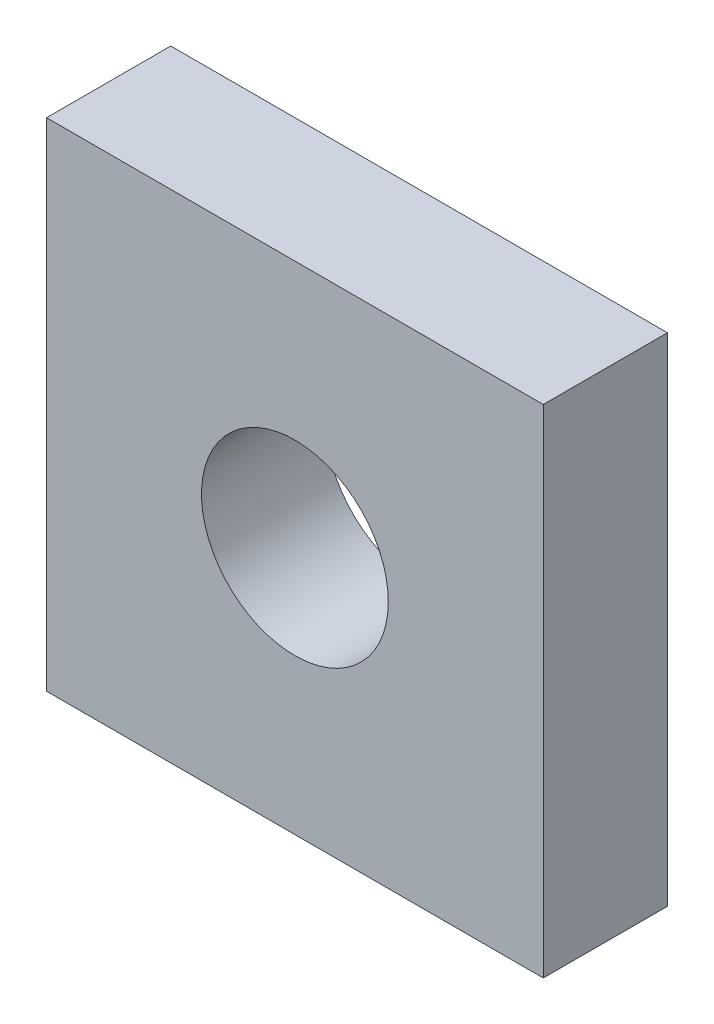
ISO-10303-21;
HEADER;
FILE_DESCRIPTION(('STEP AP214'),'2;1');
FILE_NAME('part.step','',(''),(''),'','','');
FILE_SCHEMA(('AUTOMOTIVE_DESIGN { 1 0 10303 214 1 1 1 1 }'));
ENDSEC;
DATA;
#1=APPLICATION_CONTEXT('core data for automotive mechanical design processes');
#2=APPLICATION_PROTOCOL_DEFINITION('international standard','automotive_design',2000,#1);
#3=PRODUCT_CONTEXT('',#1,'mechanical');
#4=PRODUCT('Part','Part','',(#3));
#5=PRODUCT_RELATED_PRODUCT_CATEGORY('part','',(#4));
#6=PRODUCT_DEFINITION_FORMATION('','',#4);
#7=PRODUCT_DEFINITION_CONTEXT('part definition',#1,'design');
#8=PRODUCT_DEFINITION('design','',#6,#7);
#9=PRODUCT_DEFINITION_SHAPE('','',#8);
#10=(LENGTH_UNIT() NAMED_UNIT(*) SI_UNIT(.MILLI.,.METRE.));
#11=(NAMED_UNIT(*) PLANE_ANGLE_UNIT() SI_UNIT($,.RADIAN.));
#12=(NAMED_UNIT(*) SI_UNIT($,.STERADIAN.) SOLID_ANGLE_UNIT());
#13=UNCERTAINTY_MEASURE_WITH_UNIT(LENGTH_MEASURE(1.E-05),#10,'distance_accuracy_value','');
#14=(GEOMETRIC_REPRESENTATION_CONTEXT(3) GLOBAL_UNCERTAINTY_ASSIGNED_CONTEXT((#13)) GLOBAL_UNIT_ASSIGNED_CONTEXT((#10,
#11,#12)) REPRESENTATION_CONTEXT('',''));
#15=CARTESIAN_POINT('',(0.,0.,0.));
#16=DIRECTION('',(0.,0.,1.));
#17=DIRECTION('',(1.,0.,0.));
#18=AXIS2_PLACEMENT_3D('',#15,#16,#17);
#19=CARTESIAN_POINT('',(0.,0.,6.35));
#20=DIRECTION('',(0.,0.,-1.));
#21=DIRECTION('',(-1.,0.,0.));
#22=AXIS2_PLACEMENT_3D('',#19,#20,#21);
#23=PLANE('',#22);
#24=DIRECTION('',(1.,0.,0.));
#25=VECTOR('',#24,1.);
#26=CARTESIAN_POINT('',(-12.8606597692116,-5.85860277987313,6.35));
#27=LINE('',#26,#25);
#28=CARTESIAN_POINT('',(-12.8606597692116,-5.85860277987313,6.35));
#29=VERTEX_POINT('',#28);
#30=CARTESIAN_POINT('',(12.5393402307884,-5.85860277987313,6.35));
#31=VERTEX_POINT('',#30);
#32=EDGE_CURVE('E89',#29,#31,#27,.T.);
#33=ORIENTED_EDGE('',*,*,#32,.T.);
#34=DIRECTION('',(0.,1.,0.));
#35=VECTOR('',#34,1.);
#36=CARTESIAN_POINT('',(12.5393402307884,19.5413972201269,6.35));
#37=LINE('',#36,#35);
#38=CARTESIAN_POINT('',(12.5393402307884,19.5413972201269,6.35));
#39=VERTEX_POINT('',#38);
#40=EDGE_CURVE('E84',#31,#39,#37,.T.);
#41=ORIENTED_EDGE('',*,*,#40,.T.);
#42=DIRECTION('',(-1.,0.,0.));
#43=VECTOR('',#42,1.);
#44=CARTESIAN_POINT('',(-12.8606597692116,19.5413972201269,6.35));
#45=LINE('',#44,#43);
#46=CARTESIAN_POINT('',(-12.8606597692116,19.5413972201269,6.35));
#47=VERTEX_POINT('',#46);
#48=EDGE_CURVE('E87',#39,#47,#45,.T.);
#49=ORIENTED_EDGE('',*,*,#48,.T.);
#50=DIRECTION('',(0.,-1.,0.));
#51=VECTOR('',#50,1.);
#52=CARTESIAN_POINT('',(-12.8606597692116,19.5413972201269,6.35));
#53=LINE('',#52,#51);
#54=EDGE_CURVE('E54',#47,#29,#53,.T.);
#55=ORIENTED_EDGE('',*,*,#54,.T.);
#56=EDGE_LOOP('',(#33,#41,#49,#55));
#57=FACE_BOUND('',#56,.T.);
#58=CARTESIAN_POINT('',(-0.160659769211641,6.84139722012688,6.35));
#59=DIRECTION('',(0.,0.,1.));
#60=DIRECTION('',(1.,0.,0.));
#61=AXIS2_PLACEMENT_3D('',#58,#59,#60);
#62=CIRCLE('',#61,4.7752);
#63=CARTESIAN_POINT('',(4.61454023078836,6.84139722012688,6.35));
#64=VERTEX_POINT('',#63);
#65=EDGE_CURVE('E104',#64,#64,#62,.T.);
#66=ORIENTED_EDGE('',*,*,#65,.F.);
#67=EDGE_LOOP('',(#66));
#68=FACE_BOUND('',#67,.T.);
#69=ADVANCED_FACE('F37',(#57,#68),#23,.F.);
#70=CARTESIAN_POINT('',(0.,0.,0.));
#71=DIRECTION('',(0.,0.,-1.));
#72=DIRECTION('',(-1.,0.,0.));
#73=AXIS2_PLACEMENT_3D('',#70,#71,#72);
#74=PLANE('',#73);
#75=DIRECTION('',(1.,0.,0.));
#76=VECTOR('',#75,1.);
#77=CARTESIAN_POINT('',(-12.8606597692116,-5.85860277987313,0.));
#78=LINE('',#77,#76);
#79=CARTESIAN_POINT('',(-12.8606597692116,-5.85860277987313,0.));
#80=VERTEX_POINT('',#79);
#81=CARTESIAN_POINT('',(12.5393402307884,-5.85860277987313,0.));
#82=VERTEX_POINT('',#81);
#83=EDGE_CURVE('E101',#80,#82,#78,.T.);
#84=ORIENTED_EDGE('',*,*,#83,.F.);
#85=DIRECTION('',(0.,-1.,0.));
#86=VECTOR('',#85,1.);
#87=CARTESIAN_POINT('',(-12.8606597692116,19.5413972201269,0.));
#88=LINE('',#87,#86);
#89=CARTESIAN_POINT('',(-12.8606597692116,19.5413972201269,0.));
#90=VERTEX_POINT('',#89);
#91=EDGE_CURVE('E77',#90,#80,#88,.T.);
#92=ORIENTED_EDGE('',*,*,#91,.F.);
#93=DIRECTION('',(-1.,0.,0.));
#94=VECTOR('',#93,1.);
#95=CARTESIAN_POINT('',(-12.8606597692116,19.5413972201269,0.));
#96=LINE('',#95,#94);
#97=CARTESIAN_POINT('',(12.5393402307884,19.5413972201269,0.));
#98=VERTEX_POINT('',#97);
#99=EDGE_CURVE('E71',#98,#90,#96,.T.);
#100=ORIENTED_EDGE('',*,*,#99,.F.);
#101=DIRECTION('',(0.,1.,0.));
#102=VECTOR('',#101,1.);
#103=CARTESIAN_POINT('',(12.5393402307884,19.5413972201269,0.));
#104=LINE('',#103,#102);
#105=EDGE_CURVE('E93',#82,#98,#104,.T.);
#106=ORIENTED_EDGE('',*,*,#105,.F.);
#107=EDGE_LOOP('',(#84,#92,#100,#106));
#108=FACE_BOUND('',#107,.T.);
#109=CARTESIAN_POINT('',(-0.160659769211641,6.84139722012688,0.));
#110=DIRECTION('',(0.,0.,1.));
#111=DIRECTION('',(1.,0.,0.));
#112=AXIS2_PLACEMENT_3D('',#109,#110,#111);
#113=CIRCLE('',#112,4.7752);
#114=CARTESIAN_POINT('',(4.61454023078836,6.84139722012688,0.));
#115=VERTEX_POINT('',#114);
#116=EDGE_CURVE('E116',#115,#115,#113,.T.);
#117=ORIENTED_EDGE('',*,*,#116,.T.);
#118=EDGE_LOOP('',(#117));
#119=FACE_BOUND('',#118,.T.);
#120=ADVANCED_FACE('F112',(#108,#119),#74,.T.);
#121=CARTESIAN_POINT('',(-12.8606597692116,-5.85860277987313,6.35));
#122=DIRECTION('',(0.,1.,0.));
#123=DIRECTION('',(0.,0.,1.));
#124=AXIS2_PLACEMENT_3D('',#121,#122,#123);
#125=PLANE('',#124);
#126=ORIENTED_EDGE('',*,*,#83,.T.);
#127=DIRECTION('',(0.,0.,-1.));
#128=VECTOR('',#127,1.);
#129=CARTESIAN_POINT('',(12.5393402307884,-5.85860277987313,6.35));
#130=LINE('',#129,#128);
#131=EDGE_CURVE('E11',#31,#82,#130,.T.);
#132=ORIENTED_EDGE('',*,*,#131,.F.);
#133=ORIENTED_EDGE('',*,*,#32,.F.);
#134=DIRECTION('',(0.,0.,-1.));
#135=VECTOR('',#134,1.);
#136=CARTESIAN_POINT('',(-12.8606597692116,-5.85860277987313,6.35));
#137=LINE('',#136,#135);
#138=EDGE_CURVE('E97',#29,#80,#137,.T.);
#139=ORIENTED_EDGE('',*,*,#138,.T.);
#140=EDGE_LOOP('',(#126,#132,#133,#139));
#141=FACE_BOUND('',#140,.T.);
#142=ADVANCED_FACE('F39',(#141),#125,.F.);
#143=CARTESIAN_POINT('',(12.5393402307884,19.5413972201269,6.35));
#144=DIRECTION('',(-1.,0.,0.));
#145=DIRECTION('',(0.,-1.,0.));
#146=AXIS2_PLACEMENT_3D('',#143,#144,#145);
#147=PLANE('',#146);
#148=ORIENTED_EDGE('',*,*,#105,.T.);
#149=DIRECTION('',(0.,0.,-1.));
#150=VECTOR('',#149,1.);
#151=CARTESIAN_POINT('',(12.5393402307884,19.5413972201269,6.35));
#152=LINE('',#151,#150);
#153=EDGE_CURVE('E46',#39,#98,#152,.T.);
#154=ORIENTED_EDGE('',*,*,#153,.F.);
#155=ORIENTED_EDGE('',*,*,#40,.F.);
#156=ORIENTED_EDGE('',*,*,#131,.T.);
#157=EDGE_LOOP('',(#148,#154,#155,#156));
#158=FACE_BOUND('',#157,.T.);
#159=ADVANCED_FACE('F92',(#158),#147,.F.);
#160=CARTESIAN_POINT('',(-12.8606597692116,19.5413972201269,6.35));
#161=DIRECTION('',(0.,-1.,0.));
#162=DIRECTION('',(0.,0.,-1.));
#163=AXIS2_PLACEMENT_3D('',#160,#161,#162);
#164=PLANE('',#163);
#165=ORIENTED_EDGE('',*,*,#99,.T.);
#166=DIRECTION('',(0.,0.,-1.));
#167=VECTOR('',#166,1.);
#168=CARTESIAN_POINT('',(-12.8606597692116,19.5413972201269,6.35));
#169=LINE('',#168,#167);
#170=EDGE_CURVE('E94',#47,#90,#169,.T.);
#171=ORIENTED_EDGE('',*,*,#170,.F.);
#172=ORIENTED_EDGE('',*,*,#48,.F.);
#173=ORIENTED_EDGE('',*,*,#153,.T.);
#174=EDGE_LOOP('',(#165,#171,#172,#173));
#175=FACE_BOUND('',#174,.T.);
#176=ADVANCED_FACE('F95',(#175),#164,.F.);
#177=CARTESIAN_POINT('',(-12.8606597692116,19.5413972201269,6.35));
#178=DIRECTION('',(1.,0.,0.));
#179=DIRECTION('',(0.,1.,0.));
#180=AXIS2_PLACEMENT_3D('',#177,#178,#179);
#181=PLANE('',#180);
#182=ORIENTED_EDGE('',*,*,#91,.T.);
#183=ORIENTED_EDGE('',*,*,#138,.F.);
#184=ORIENTED_EDGE('',*,*,#54,.F.);
#185=ORIENTED_EDGE('',*,*,#170,.T.);
#186=EDGE_LOOP('',(#182,#183,#184,#185));
#187=FACE_BOUND('',#186,.T.);
#188=ADVANCED_FACE('F109',(#187),#181,.F.);
#189=CARTESIAN_POINT('',(-0.160659769211641,6.84139722012688,6.35));
#190=DIRECTION('',(0.,0.,-1.));
#191=DIRECTION('',(-1.,0.,0.));
#192=AXIS2_PLACEMENT_3D('',#189,#190,#191);
#193=CYLINDRICAL_SURFACE('',#192,4.7752);
#194=ORIENTED_EDGE('',*,*,#65,.T.);
#195=EDGE_LOOP('',(#194));
#196=FACE_BOUND('',#195,.T.);
#197=ORIENTED_EDGE('',*,*,#116,.F.);
#198=EDGE_LOOP('',(#197));
#199=FACE_BOUND('',#198,.T.);
#200=ADVANCED_FACE('F122',(#196,#199),#193,.F.);
#201=CLOSED_SHELL('',(#69,#120,#142,#159,#176,#188,#200));
#202=MANIFOLD_SOLID_BREP('B2',#201);
#203=ADVANCED_BREP_SHAPE_REPRESENTATION('',(#18,#202),#14);
#204=SHAPE_DEFINITION_REPRESENTATION(#9,#203);
ENDSEC;
END-ISO-10303-21;
